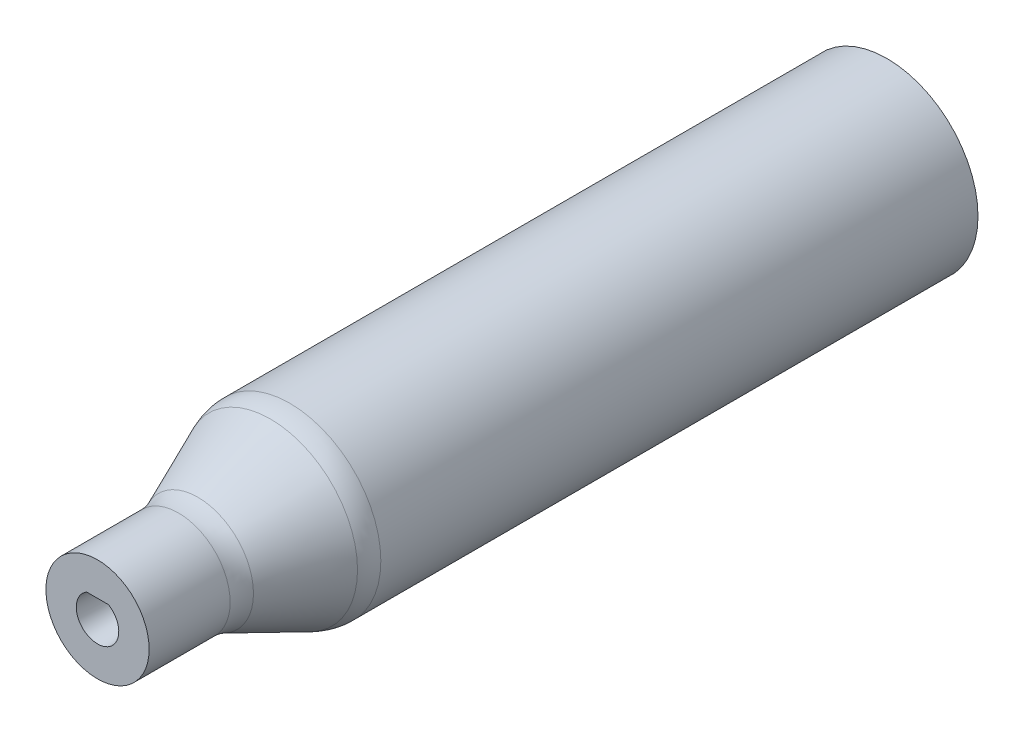
ISO-10303-21;
HEADER;
FILE_DESCRIPTION(('STEP AP214'),'2;1');
FILE_NAME('part.step','',(''),(''),'','','');
FILE_SCHEMA(('AUTOMOTIVE_DESIGN { 1 0 10303 214 1 1 1 1 }'));
ENDSEC;
DATA;
#1=APPLICATION_CONTEXT('core data for automotive mechanical design processes');
#2=APPLICATION_PROTOCOL_DEFINITION('international standard','automotive_design',2000,#1);
#3=PRODUCT_CONTEXT('',#1,'mechanical');
#4=PRODUCT('Part','Part','',(#3));
#5=PRODUCT_RELATED_PRODUCT_CATEGORY('part','',(#4));
#6=PRODUCT_DEFINITION_FORMATION('','',#4);
#7=PRODUCT_DEFINITION_CONTEXT('part definition',#1,'design');
#8=PRODUCT_DEFINITION('design','',#6,#7);
#9=PRODUCT_DEFINITION_SHAPE('','',#8);
#10=(LENGTH_UNIT() NAMED_UNIT(*) SI_UNIT(.MILLI.,.METRE.));
#11=(NAMED_UNIT(*) PLANE_ANGLE_UNIT() SI_UNIT($,.RADIAN.));
#12=(NAMED_UNIT(*) SI_UNIT($,.STERADIAN.) SOLID_ANGLE_UNIT());
#13=UNCERTAINTY_MEASURE_WITH_UNIT(LENGTH_MEASURE(1.E-05),#10,'distance_accuracy_value','');
#14=(GEOMETRIC_REPRESENTATION_CONTEXT(3) GLOBAL_UNCERTAINTY_ASSIGNED_CONTEXT((#13)) GLOBAL_UNIT_ASSIGNED_CONTEXT((#10,
#11,#12)) REPRESENTATION_CONTEXT('',''));
#15=CARTESIAN_POINT('',(0.,0.,0.));
#16=DIRECTION('',(0.,0.,1.));
#17=DIRECTION('',(1.,0.,0.));
#18=AXIS2_PLACEMENT_3D('',#15,#16,#17);
#19=CARTESIAN_POINT('',(0.,0.,130.));
#20=DIRECTION('',(0.,0.,-1.));
#21=DIRECTION('',(-1.,0.,0.));
#22=AXIS2_PLACEMENT_3D('',#19,#20,#21);
#23=CYLINDRICAL_SURFACE('',#22,15.);
#24=CARTESIAN_POINT('',(0.,0.,98.3411904932039));
#25=DIRECTION('',(0.,0.,-1.));
#26=DIRECTION('',(-1.,0.,0.));
#27=AXIS2_PLACEMENT_3D('',#24,#25,#26);
#28=CIRCLE('',#27,15.);
#29=CARTESIAN_POINT('',(-15.,0.,98.3411904932039));
#30=VERTEX_POINT('',#29);
#31=EDGE_CURVE('E58',#30,#30,#28,.T.);
#32=ORIENTED_EDGE('',*,*,#31,.T.);
#33=EDGE_LOOP('',(#32));
#34=FACE_BOUND('',#33,.T.);
#35=CARTESIAN_POINT('',(0.,0.,0.));
#36=DIRECTION('',(0.,0.,1.));
#37=DIRECTION('',(1.,0.,0.));
#38=AXIS2_PLACEMENT_3D('',#35,#36,#37);
#39=CIRCLE('',#38,15.);
#40=CARTESIAN_POINT('',(15.,0.,0.));
#41=VERTEX_POINT('',#40);
#42=EDGE_CURVE('E133',#41,#41,#39,.T.);
#43=ORIENTED_EDGE('',*,*,#42,.T.);
#44=EDGE_LOOP('',(#43));
#45=FACE_BOUND('',#44,.T.);
#46=ADVANCED_FACE('F55',(#34,#45),#23,.T.);
#47=CARTESIAN_POINT('',(0.,0.,0.));
#48=DIRECTION('',(0.,0.,1.));
#49=DIRECTION('',(1.,0.,0.));
#50=AXIS2_PLACEMENT_3D('',#47,#48,#49);
#51=PLANE('',#50);
#52=DIRECTION('',(0.,-1.,0.));
#53=VECTOR('',#52,1.);
#54=CARTESIAN_POINT('',(2.,9.79795897113272,0.));
#55=LINE('',#54,#53);
#56=CARTESIAN_POINT('',(2.,9.79795897113271,0.));
#57=VERTEX_POINT('',#56);
#58=CARTESIAN_POINT('',(2.,7.10943001113271,0.));
#59=VERTEX_POINT('',#58);
#60=EDGE_CURVE('E354',#57,#59,#55,.T.);
#61=ORIENTED_EDGE('',*,*,#60,.T.);
#62=DIRECTION('',(-1.,0.,0.));
#63=VECTOR('',#62,1.);
#64=CARTESIAN_POINT('',(2.,7.10943001113271,0.));
#65=LINE('',#64,#63);
#66=CARTESIAN_POINT('',(-2.,7.10943001113271,0.));
#67=VERTEX_POINT('',#66);
#68=EDGE_CURVE('E359',#59,#67,#65,.T.);
#69=ORIENTED_EDGE('',*,*,#68,.T.);
#70=DIRECTION('',(0.,1.,0.));
#71=VECTOR('',#70,1.);
#72=CARTESIAN_POINT('',(-2.,7.10943001113271,0.));
#73=LINE('',#72,#71);
#74=CARTESIAN_POINT('',(-2.,9.79795897113272,0.));
#75=VERTEX_POINT('',#74);
#76=EDGE_CURVE('E230',#67,#75,#73,.T.);
#77=ORIENTED_EDGE('',*,*,#76,.T.);
#78=CARTESIAN_POINT('',(0.,0.,0.));
#79=DIRECTION('',(0.,0.,1.));
#80=DIRECTION('',(1.,0.,0.));
#81=AXIS2_PLACEMENT_3D('',#78,#79,#80);
#82=CIRCLE('',#81,10.);
#83=EDGE_CURVE('E211',#75,#57,#82,.T.);
#84=ORIENTED_EDGE('',*,*,#83,.T.);
#85=EDGE_LOOP('',(#61,#69,#77,#84));
#86=FACE_BOUND('',#85,.T.);
#87=ORIENTED_EDGE('',*,*,#42,.F.);
#88=EDGE_LOOP('',(#87));
#89=FACE_BOUND('',#88,.T.);
#90=ADVANCED_FACE('F321',(#86,#89),#51,.F.);
#91=CARTESIAN_POINT('',(0.,0.,100.));
#92=DIRECTION('',(0.,0.,-1.));
#93=DIRECTION('',(-1.,0.,0.));
#94=AXIS2_PLACEMENT_3D('',#91,#92,#93);
#95=PLANE('',#94);
#96=CARTESIAN_POINT('',(0.,0.,100.));
#97=DIRECTION('',(0.,0.,-1.));
#98=DIRECTION('',(-1.,0.,0.));
#99=AXIS2_PLACEMENT_3D('',#96,#97,#98);
#100=CIRCLE('',#99,7.);
#101=CARTESIAN_POINT('',(3.,6.32455532033676,100.));
#102=VERTEX_POINT('',#101);
#103=CARTESIAN_POINT('',(-3.,6.32455532033676,100.));
#104=VERTEX_POINT('',#103);
#105=EDGE_CURVE('E238',#102,#104,#100,.T.);
#106=ORIENTED_EDGE('',*,*,#105,.T.);
#107=DIRECTION('',(0.,-1.,0.));
#108=VECTOR('',#107,1.);
#109=CARTESIAN_POINT('',(-3.,6.32455532033676,100.));
#110=LINE('',#109,#108);
#111=CARTESIAN_POINT('',(-3.,3.63602636033676,100.));
#112=VERTEX_POINT('',#111);
#113=EDGE_CURVE('E337',#104,#112,#110,.T.);
#114=ORIENTED_EDGE('',*,*,#113,.T.);
#115=DIRECTION('',(1.,0.,0.));
#116=VECTOR('',#115,1.);
#117=CARTESIAN_POINT('',(-3.,3.63602636033676,100.));
#118=LINE('',#117,#116);
#119=CARTESIAN_POINT('',(3.,3.63602636033676,100.));
#120=VERTEX_POINT('',#119);
#121=EDGE_CURVE('E305',#112,#120,#118,.T.);
#122=ORIENTED_EDGE('',*,*,#121,.T.);
#123=DIRECTION('',(0.,1.,0.));
#124=VECTOR('',#123,1.);
#125=CARTESIAN_POINT('',(3.,3.63602636033676,100.));
#126=LINE('',#125,#124);
#127=EDGE_CURVE('E248',#120,#102,#126,.T.);
#128=ORIENTED_EDGE('',*,*,#127,.T.);
#129=EDGE_LOOP('',(#106,#114,#122,#128));
#130=FACE_BOUND('',#129,.T.);
#131=ADVANCED_FACE('F312',(#130),#95,.T.);
#132=CARTESIAN_POINT('',(0.,7.10086315140669,0.246641639938985));
#133=DIRECTION('',(0.,0.999397318629332,0.0347131029512281));
#134=DIRECTION('',(0.,-0.0347131029512281,0.999397318629332));
#135=AXIS2_PLACEMENT_3D('',#132,#133,#134);
#136=PLANE('',#135);
#137=DIRECTION('',(-0.00999347412715465,-0.0347113695173939,0.999347412715466));
#138=VECTOR('',#137,1.);
#139=CARTESIAN_POINT('',(-2.,7.10943001113271,0.));
#140=LINE('',#139,#138);
#141=EDGE_CURVE('E219',#67,#112,#140,.T.);
#142=ORIENTED_EDGE('',*,*,#141,.F.);
#143=ORIENTED_EDGE('',*,*,#68,.F.);
#144=DIRECTION('',(0.00999347412715466,-0.034711369517394,0.999347412715466));
#145=VECTOR('',#144,1.);
#146=CARTESIAN_POINT('',(2.,7.10943001113271,0.));
#147=LINE('',#146,#145);
#148=EDGE_CURVE('E226',#59,#120,#147,.T.);
#149=ORIENTED_EDGE('',*,*,#148,.T.);
#150=ORIENTED_EDGE('',*,*,#121,.F.);
#151=EDGE_LOOP('',(#142,#143,#149,#150));
#152=FACE_BOUND('',#151,.T.);
#153=ADVANCED_FACE('F266',(#152),#136,.F.);
#154=CARTESIAN_POINT('',(1.999800019998,0.,-0.01999800019998));
#155=DIRECTION('',(-0.999950003749688,0.,0.00999950003749687));
#156=DIRECTION('',(0.00999950003749687,0.,0.999950003749688));
#157=AXIS2_PLACEMENT_3D('',#154,#155,#156);
#158=PLANE('',#157);
#159=ORIENTED_EDGE('',*,*,#148,.F.);
#160=ORIENTED_EDGE('',*,*,#60,.F.);
#161=DIRECTION('',(0.00999347412715465,-0.0347113695173939,0.999347412715466));
#162=VECTOR('',#161,1.);
#163=CARTESIAN_POINT('',(2.5,8.06125714573474,50.));
#164=LINE('',#163,#162);
#165=EDGE_CURVE('E74',#57,#102,#164,.T.);
#166=ORIENTED_EDGE('',*,*,#165,.T.);
#167=ORIENTED_EDGE('',*,*,#127,.F.);
#168=EDGE_LOOP('',(#159,#160,#166,#167));
#169=FACE_BOUND('',#168,.T.);
#170=ADVANCED_FACE('F259',(#169),#158,.F.);
#171=CARTESIAN_POINT('',(-1.999800019998,0.,-0.01999800019998));
#172=DIRECTION('',(0.999950003749688,0.,0.00999950003749686));
#173=DIRECTION('',(0.00999950003749686,0.,-0.999950003749688));
#174=AXIS2_PLACEMENT_3D('',#171,#172,#173);
#175=PLANE('',#174);
#176=DIRECTION('',(-0.00999347412715465,-0.0347113695173939,0.999347412715466));
#177=VECTOR('',#176,1.);
#178=CARTESIAN_POINT('',(-2.,9.79795897113272,0.));
#179=LINE('',#178,#177);
#180=EDGE_CURVE('E235',#75,#104,#179,.T.);
#181=ORIENTED_EDGE('',*,*,#180,.F.);
#182=ORIENTED_EDGE('',*,*,#76,.F.);
#183=ORIENTED_EDGE('',*,*,#141,.T.);
#184=ORIENTED_EDGE('',*,*,#113,.F.);
#185=EDGE_LOOP('',(#181,#182,#183,#184));
#186=FACE_BOUND('',#185,.T.);
#187=ADVANCED_FACE('F264',(#186),#175,.F.);
#188=CARTESIAN_POINT('',(-2.,9.79795897113271,0.));
#189=CARTESIAN_POINT('',(-3.,6.32455532033676,100.));
#190=CARTESIAN_POINT('',(-18.23346897853,6.48431599174119,0.));
#191=CARTESIAN_POINT('',(-11.5737558425409,2.257665835646,100.));
#192=CARTESIAN_POINT('',(-16.5682148969576,-10.,0.));
#193=CARTESIAN_POINT('',(-9.48940879761177,-7.,100.));
#194=CARTESIAN_POINT('',(16.5682148969576,-10.,0.));
#195=CARTESIAN_POINT('',(9.48940879761177,-7.,100.));
#196=CARTESIAN_POINT('',(18.23346897853,6.48431599174119,0.));
#197=CARTESIAN_POINT('',(11.5737558425409,2.257665835646,100.));
#198=CARTESIAN_POINT('',(2.,9.79795897113271,0.));
#199=CARTESIAN_POINT('',(3.,6.32455532033676,100.));
#200=(BOUNDED_SURFACE() B_SPLINE_SURFACE(3,1,((#188,#189),(#190,#191),(#192,#193),(#194,#195),
(#196,#197),(#198,#199)),.UNSPECIFIED.,.F.,.F.,.F.) B_SPLINE_SURFACE_WITH_KNOTS((4,2,4),(2,2),
(0.,0.5,1.),(0.,1.),
.UNSPECIFIED.) GEOMETRIC_REPRESENTATION_ITEM() RATIONAL_B_SPLINE_SURFACE(((1.,1.),
(0.160271561532699,0.230175946757931),(0.0641630060366366,0.110430720890706),
(0.0641630060366366,0.110430720890706),(0.160271561532699,0.230175946757931),(1.,1.))) REPRESENTATION_ITEM('') SURFACE());
#201=ORIENTED_EDGE('',*,*,#83,.F.);
#202=ORIENTED_EDGE('',*,*,#180,.T.);
#203=ORIENTED_EDGE('',*,*,#105,.F.);
#204=ORIENTED_EDGE('',*,*,#165,.F.);
#205=EDGE_LOOP('',(#201,#202,#203,#204));
#206=FACE_BOUND('',#205,.T.);
#207=ADVANCED_FACE('F148',(#206),#200,.F.);
#208=CARTESIAN_POINT('',(0.,0.,100.));
#209=DIRECTION('',(0.,0.,-1.));
#210=DIRECTION('',(-1.,0.,0.));
#211=AXIS2_PLACEMENT_3D('',#208,#209,#210);
#212=CONICAL_SURFACE('',#211,15.,0.408907828950925);
#213=CARTESIAN_POINT('',(0.,0.,101.522049994278));
#214=DIRECTION('',(0.,0.,1.));
#215=DIRECTION('',(1.,0.,0.));
#216=AXIS2_PLACEMENT_3D('',#213,#214,#215);
#217=CIRCLE('',#216,14.3404450024794);
#218=CARTESIAN_POINT('',(14.3404450024794,0.,101.522049994278));
#219=VERTEX_POINT('',#218);
#220=EDGE_CURVE('E135',#219,#219,#217,.T.);
#221=ORIENTED_EDGE('',*,*,#220,.T.);
#222=EDGE_LOOP('',(#221));
#223=FACE_BOUND('',#222,.T.);
#224=CARTESIAN_POINT('',(0.,0.,113.477950005722));
#225=DIRECTION('',(0.,0.,-1.));
#226=DIRECTION('',(-1.,0.,0.));
#227=AXIS2_PLACEMENT_3D('',#224,#225,#226);
#228=CIRCLE('',#227,9.1595549975206);
#229=CARTESIAN_POINT('',(-9.1595549975206,0.,113.477950005722));
#230=VERTEX_POINT('',#229);
#231=EDGE_CURVE('E128',#230,#230,#228,.T.);
#232=ORIENTED_EDGE('',*,*,#231,.T.);
#233=EDGE_LOOP('',(#232));
#234=FACE_BOUND('',#233,.T.);
#235=ADVANCED_FACE('F143',(#223,#234),#212,.T.);
#236=CARTESIAN_POINT('',(0.,0.,136.467968661603));
#237=DIRECTION('',(0.,0.,1.));
#238=DIRECTION('',(1.,0.,0.));
#239=AXIS2_PLACEMENT_3D('',#236,#237,#238);
#240=CYLINDRICAL_SURFACE('',#239,8.5);
#241=CARTESIAN_POINT('',(0.,0.,116.658809506796));
#242=DIRECTION('',(0.,0.,1.));
#243=DIRECTION('',(1.,0.,0.));
#244=AXIS2_PLACEMENT_3D('',#241,#242,#243);
#245=CIRCLE('',#244,8.5);
#246=CARTESIAN_POINT('',(8.5,0.,116.658809506796));
#247=VERTEX_POINT('',#246);
#248=EDGE_CURVE('E12',#247,#247,#245,.T.);
#249=ORIENTED_EDGE('',*,*,#248,.T.);
#250=EDGE_LOOP('',(#249));
#251=FACE_BOUND('',#250,.T.);
#252=CARTESIAN_POINT('',(0.,0.,130.));
#253=DIRECTION('',(0.,0.,1.));
#254=DIRECTION('',(1.,0.,0.));
#255=AXIS2_PLACEMENT_3D('',#252,#253,#254);
#256=CIRCLE('',#255,8.5);
#257=CARTESIAN_POINT('',(8.5,0.,130.));
#258=VERTEX_POINT('',#257);
#259=EDGE_CURVE('E118',#258,#258,#256,.T.);
#260=ORIENTED_EDGE('',*,*,#259,.F.);
#261=EDGE_LOOP('',(#260));
#262=FACE_BOUND('',#261,.T.);
#263=ADVANCED_FACE('F150',(#251,#262),#240,.T.);
#264=CARTESIAN_POINT('',(0.,0.,115.));
#265=DIRECTION('',(0.,0.,-1.));
#266=DIRECTION('',(-1.,0.,0.));
#267=AXIS2_PLACEMENT_3D('',#264,#265,#266);
#268=PLANE('',#267);
#269=CARTESIAN_POINT('',(0.,0.,115.));
#270=DIRECTION('',(0.,0.,-1.));
#271=DIRECTION('',(-1.,0.,0.));
#272=AXIS2_PLACEMENT_3D('',#269,#270,#271);
#273=CIRCLE('',#272,2.49999999999999);
#274=CARTESIAN_POINT('',(1.8,1.73493515728974,115.));
#275=VERTEX_POINT('',#274);
#276=CARTESIAN_POINT('',(-1.8,1.73493515728974,115.));
#277=VERTEX_POINT('',#276);
#278=EDGE_CURVE('E166',#275,#277,#273,.T.);
#279=ORIENTED_EDGE('',*,*,#278,.F.);
#280=DIRECTION('',(1.,0.,0.));
#281=VECTOR('',#280,1.);
#282=CARTESIAN_POINT('',(-1.8,1.73493515728974,115.));
#283=LINE('',#282,#281);
#284=EDGE_CURVE('E115',#277,#275,#283,.T.);
#285=ORIENTED_EDGE('',*,*,#284,.F.);
#286=EDGE_LOOP('',(#279,#285));
#287=FACE_BOUND('',#286,.T.);
#288=ADVANCED_FACE('F157',(#287),#268,.F.);
#289=CARTESIAN_POINT('',(0.,-7.92018602165455,0.668849701935958));
#290=DIRECTION('',(0.,-0.996453165148604,0.0841492107231538));
#291=DIRECTION('',(0.,-0.0841492107231538,-0.996453165148604));
#292=AXIS2_PLACEMENT_3D('',#289,#290,#291);
#293=PLANE('',#292);
#294=DIRECTION('',(0.,-0.0841492107231537,-0.996453165148603));
#295=VECTOR('',#294,1.);
#296=CARTESIAN_POINT('',(1.8,3.00166620396073,130.));
#297=LINE('',#296,#295);
#298=CARTESIAN_POINT('',(1.8,3.00166620396073,130.));
#299=VERTEX_POINT('',#298);
#300=EDGE_CURVE('E106',#299,#275,#297,.T.);
#301=ORIENTED_EDGE('',*,*,#300,.F.);
#302=DIRECTION('',(-1.,0.,0.));
#303=VECTOR('',#302,1.);
#304=CARTESIAN_POINT('',(1.8,3.00166620396073,130.));
#305=LINE('',#304,#303);
#306=CARTESIAN_POINT('',(-1.8,3.00166620396073,130.));
#307=VERTEX_POINT('',#306);
#308=EDGE_CURVE('E107',#299,#307,#305,.T.);
#309=ORIENTED_EDGE('',*,*,#308,.T.);
#310=DIRECTION('',(0.,-0.0841492107231538,-0.996453165148603));
#311=VECTOR('',#310,1.);
#312=CARTESIAN_POINT('',(-1.8,3.00166620396073,130.));
#313=LINE('',#312,#311);
#314=EDGE_CURVE('E70',#307,#277,#313,.T.);
#315=ORIENTED_EDGE('',*,*,#314,.T.);
#316=ORIENTED_EDGE('',*,*,#284,.T.);
#317=EDGE_LOOP('',(#301,#309,#315,#316));
#318=FACE_BOUND('',#317,.T.);
#319=ADVANCED_FACE('F110',(#318),#293,.T.);
#320=CARTESIAN_POINT('',(1.8,3.00166620396073,130.));
#321=CARTESIAN_POINT('',(1.8,1.73493515728974,115.));
#322=CARTESIAN_POINT('',(5.57254817117717,0.739393770350802,130.));
#323=CARTESIAN_POINT('',(3.5916851458691,-0.123943112029797,115.));
#324=CARTESIAN_POINT('',(4.39886306535263,-3.5,130.));
#325=CARTESIAN_POINT('',(2.58177537405492,-2.49999999999999,115.));
#326=CARTESIAN_POINT('',(-4.39886306535263,-3.5,130.));
#327=CARTESIAN_POINT('',(-2.58177537405491,-2.49999999999999,115.));
#328=CARTESIAN_POINT('',(-5.57254817117717,0.739393770350803,130.));
#329=CARTESIAN_POINT('',(-3.5916851458691,-0.123943112029797,115.));
#330=CARTESIAN_POINT('',(-1.8,3.00166620396073,130.));
#331=CARTESIAN_POINT('',(-1.8,1.73493515728974,115.));
#332=(BOUNDED_SURFACE() B_SPLINE_SURFACE(3,1,((#320,#321),(#322,#323),(#324,#325),(#326,#327),
(#328,#329),(#330,#331)),.UNSPECIFIED.,.F.,.F.,.F.) B_SPLINE_SURFACE_WITH_KNOTS((4,2,4),(2,2),
(0.,0.5,1.),(0.,1.),
.UNSPECIFIED.) GEOMETRIC_REPRESENTATION_ITEM() RATIONAL_B_SPLINE_SURFACE(((1.,1.),
(0.261336044824177,0.352969639940352),(0.133597696789677,0.209703668461163),(0.133597696789677,
0.209703668461163),(0.261336044824177,0.352969639940352),(1.,1.))) REPRESENTATION_ITEM('') SURFACE());
#333=CARTESIAN_POINT('',(0.,0.,130.));
#334=DIRECTION('',(0.,0.,1.));
#335=DIRECTION('',(1.,0.,0.));
#336=AXIS2_PLACEMENT_3D('',#333,#334,#335);
#337=CIRCLE('',#336,3.5);
#338=EDGE_CURVE('E116',#307,#299,#337,.T.);
#339=ORIENTED_EDGE('',*,*,#338,.T.);
#340=ORIENTED_EDGE('',*,*,#300,.T.);
#341=ORIENTED_EDGE('',*,*,#278,.T.);
#342=ORIENTED_EDGE('',*,*,#314,.F.);
#343=EDGE_LOOP('',(#339,#340,#341,#342));
#344=FACE_BOUND('',#343,.T.);
#345=ADVANCED_FACE('F120',(#344),#332,.F.);
#346=CARTESIAN_POINT('',(0.,0.,130.));
#347=DIRECTION('',(0.,0.,1.));
#348=DIRECTION('',(1.,0.,0.));
#349=AXIS2_PLACEMENT_3D('',#346,#347,#348);
#350=PLANE('',#349);
#351=ORIENTED_EDGE('',*,*,#338,.F.);
#352=ORIENTED_EDGE('',*,*,#308,.F.);
#353=EDGE_LOOP('',(#351,#352));
#354=FACE_BOUND('',#353,.T.);
#355=ORIENTED_EDGE('',*,*,#259,.T.);
#356=EDGE_LOOP('',(#355));
#357=FACE_BOUND('',#356,.T.);
#358=ADVANCED_FACE('F122',(#354,#357),#350,.T.);
#359=CARTESIAN_POINT('',(0.,0.,98.3411904932039));
#360=DIRECTION('',(0.,0.,-1.));
#361=DIRECTION('',(-1.,0.,0.));
#362=AXIS2_PLACEMENT_3D('',#359,#360,#361);
#363=DEGENERATE_TOROIDAL_SURFACE('',#362,7.,8.,.T.);
#364=ORIENTED_EDGE('',*,*,#31,.F.);
#365=EDGE_LOOP('',(#364));
#366=FACE_BOUND('',#365,.T.);
#367=ORIENTED_EDGE('',*,*,#220,.F.);
#368=EDGE_LOOP('',(#367));
#369=FACE_BOUND('',#368,.T.);
#370=ADVANCED_FACE('F139',(#366,#369),#363,.T.);
#371=CARTESIAN_POINT('',(0.,0.,116.658809506796));
#372=DIRECTION('',(0.,0.,1.));
#373=DIRECTION('',(1.,0.,0.));
#374=AXIS2_PLACEMENT_3D('',#371,#372,#373);
#375=TOROIDAL_SURFACE('',#374,16.5,8.);
#376=ORIENTED_EDGE('',*,*,#231,.F.);
#377=EDGE_LOOP('',(#376));
#378=FACE_BOUND('',#377,.T.);
#379=ORIENTED_EDGE('',*,*,#248,.F.);
#380=EDGE_LOOP('',(#379));
#381=FACE_BOUND('',#380,.T.);
#382=ADVANCED_FACE('F53',(#378,#381),#375,.F.);
#383=CLOSED_SHELL('',(#46,#90,#131,#153,#170,#187,#207,#235,#263,#288,#319,#345,#358,#370,#382));
#384=MANIFOLD_SOLID_BREP('B2',#383);
#385=ADVANCED_BREP_SHAPE_REPRESENTATION('',(#18,#384),#14);
#386=SHAPE_DEFINITION_REPRESENTATION(#9,#385);
ENDSEC;
END-ISO-10303-21;
